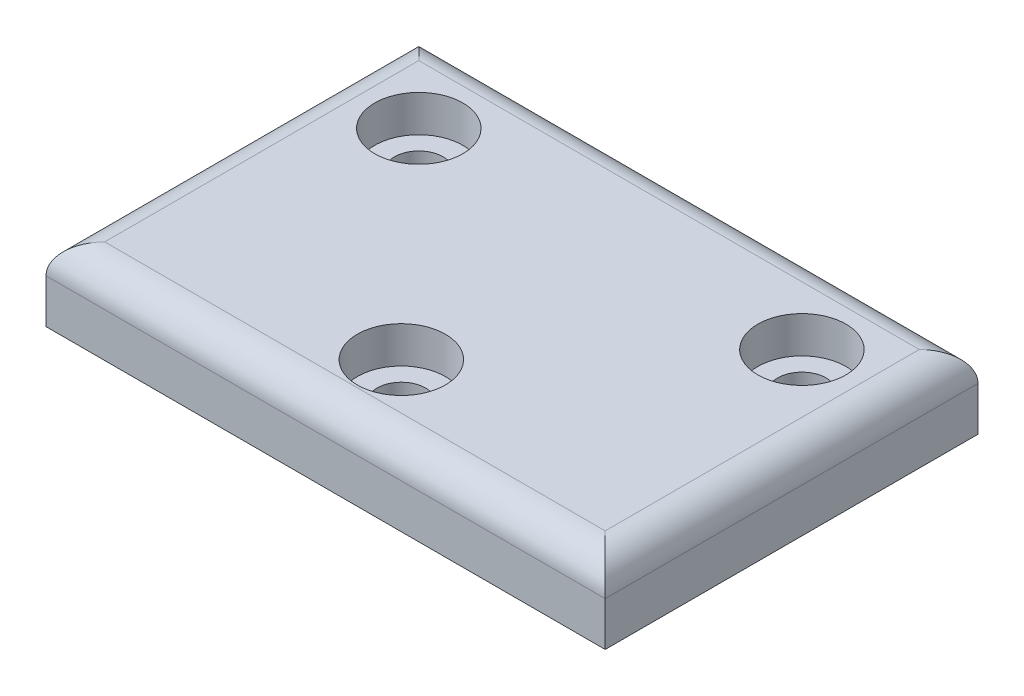
ISO-10303-21;
HEADER;
FILE_DESCRIPTION(('STEP AP214'),'2;1');
FILE_NAME('part.step','',(''),(''),'','','');
FILE_SCHEMA(('AUTOMOTIVE_DESIGN { 1 0 10303 214 1 1 1 1 }'));
ENDSEC;
DATA;
#1=APPLICATION_CONTEXT('core data for automotive mechanical design processes');
#2=APPLICATION_PROTOCOL_DEFINITION('international standard','automotive_design',2000,#1);
#3=PRODUCT_CONTEXT('',#1,'mechanical');
#4=PRODUCT('Part','Part','',(#3));
#5=PRODUCT_RELATED_PRODUCT_CATEGORY('part','',(#4));
#6=PRODUCT_DEFINITION_FORMATION('','',#4);
#7=PRODUCT_DEFINITION_CONTEXT('part definition',#1,'design');
#8=PRODUCT_DEFINITION('design','',#6,#7);
#9=PRODUCT_DEFINITION_SHAPE('','',#8);
#10=(LENGTH_UNIT() NAMED_UNIT(*) SI_UNIT(.MILLI.,.METRE.));
#11=(NAMED_UNIT(*) PLANE_ANGLE_UNIT() SI_UNIT($,.RADIAN.));
#12=(NAMED_UNIT(*) SI_UNIT($,.STERADIAN.) SOLID_ANGLE_UNIT());
#13=UNCERTAINTY_MEASURE_WITH_UNIT(LENGTH_MEASURE(1.E-05),#10,'distance_accuracy_value','');
#14=(GEOMETRIC_REPRESENTATION_CONTEXT(3) GLOBAL_UNCERTAINTY_ASSIGNED_CONTEXT((#13)) GLOBAL_UNIT_ASSIGNED_CONTEXT((#10,
#11,#12)) REPRESENTATION_CONTEXT('',''));
#15=CARTESIAN_POINT('',(0.,0.,0.));
#16=DIRECTION('',(0.,0.,1.));
#17=DIRECTION('',(1.,0.,0.));
#18=AXIS2_PLACEMENT_3D('',#15,#16,#17);
#19=CARTESIAN_POINT('',(19.05,5.,-5.16));
#20=DIRECTION('',(0.,-1.,0.));
#21=DIRECTION('',(0.,0.,-1.));
#22=AXIS2_PLACEMENT_3D('',#19,#20,#21);
#23=CYLINDRICAL_SURFACE('',#22,1.65);
#24=CARTESIAN_POINT('',(19.05,0.,-5.16));
#25=DIRECTION('',(0.,1.,0.));
#26=DIRECTION('',(0.,0.,1.));
#27=AXIS2_PLACEMENT_3D('',#24,#25,#26);
#28=CIRCLE('',#27,1.65);
#29=CARTESIAN_POINT('',(19.05,0.,-3.51));
#30=VERTEX_POINT('',#29);
#31=EDGE_CURVE('E121',#30,#30,#28,.T.);
#32=ORIENTED_EDGE('',*,*,#31,.F.);
#33=EDGE_LOOP('',(#32));
#34=FACE_BOUND('',#33,.T.);
#35=CARTESIAN_POINT('',(19.05,2.5,-5.16));
#36=DIRECTION('',(0.,1.,0.));
#37=DIRECTION('',(0.,0.,1.));
#38=AXIS2_PLACEMENT_3D('',#35,#36,#37);
#39=CIRCLE('',#38,1.65);
#40=CARTESIAN_POINT('',(19.05,2.5,-3.51));
#41=VERTEX_POINT('',#40);
#42=EDGE_CURVE('E147',#41,#41,#39,.T.);
#43=ORIENTED_EDGE('',*,*,#42,.T.);
#44=EDGE_LOOP('',(#43));
#45=FACE_BOUND('',#44,.T.);
#46=ADVANCED_FACE('F42',(#34,#45),#23,.F.);
#47=CARTESIAN_POINT('',(6.,5.,-19.4));
#48=DIRECTION('',(0.,-1.,0.));
#49=DIRECTION('',(0.,0.,-1.));
#50=AXIS2_PLACEMENT_3D('',#47,#48,#49);
#51=CYLINDRICAL_SURFACE('',#50,1.65);
#52=CARTESIAN_POINT('',(6.,0.,-19.4));
#53=DIRECTION('',(0.,1.,0.));
#54=DIRECTION('',(0.,0.,1.));
#55=AXIS2_PLACEMENT_3D('',#52,#53,#54);
#56=CIRCLE('',#55,1.65);
#57=CARTESIAN_POINT('',(6.,0.,-17.75));
#58=VERTEX_POINT('',#57);
#59=EDGE_CURVE('E124',#58,#58,#56,.T.);
#60=ORIENTED_EDGE('',*,*,#59,.F.);
#61=EDGE_LOOP('',(#60));
#62=FACE_BOUND('',#61,.T.);
#63=CARTESIAN_POINT('',(6.,2.5,-19.4));
#64=DIRECTION('',(0.,1.,0.));
#65=DIRECTION('',(0.,0.,1.));
#66=AXIS2_PLACEMENT_3D('',#63,#64,#65);
#67=CIRCLE('',#66,1.65);
#68=CARTESIAN_POINT('',(6.,2.5,-17.75));
#69=VERTEX_POINT('',#68);
#70=EDGE_CURVE('E144',#69,#69,#67,.T.);
#71=ORIENTED_EDGE('',*,*,#70,.T.);
#72=EDGE_LOOP('',(#71));
#73=FACE_BOUND('',#72,.T.);
#74=ADVANCED_FACE('F213',(#62,#73),#51,.F.);
#75=CARTESIAN_POINT('',(32.1,5.,-19.4));
#76=DIRECTION('',(0.,-1.,0.));
#77=DIRECTION('',(0.,0.,-1.));
#78=AXIS2_PLACEMENT_3D('',#75,#76,#77);
#79=CYLINDRICAL_SURFACE('',#78,1.65);
#80=CARTESIAN_POINT('',(32.1,0.,-19.4));
#81=DIRECTION('',(0.,1.,0.));
#82=DIRECTION('',(0.,0.,-1.));
#83=AXIS2_PLACEMENT_3D('',#80,#81,#82);
#84=CIRCLE('',#83,1.65);
#85=CARTESIAN_POINT('',(32.1,0.,-21.05));
#86=VERTEX_POINT('',#85);
#87=EDGE_CURVE('E152',#86,#86,#84,.T.);
#88=ORIENTED_EDGE('',*,*,#87,.F.);
#89=EDGE_LOOP('',(#88));
#90=FACE_BOUND('',#89,.T.);
#91=CARTESIAN_POINT('',(32.1,2.5,-19.4));
#92=DIRECTION('',(0.,1.,0.));
#93=DIRECTION('',(0.,0.,1.));
#94=AXIS2_PLACEMENT_3D('',#91,#92,#93);
#95=CIRCLE('',#94,1.65);
#96=CARTESIAN_POINT('',(32.1,2.5,-17.75));
#97=VERTEX_POINT('',#96);
#98=EDGE_CURVE('E143',#97,#97,#95,.T.);
#99=ORIENTED_EDGE('',*,*,#98,.T.);
#100=EDGE_LOOP('',(#99));
#101=FACE_BOUND('',#100,.T.);
#102=ADVANCED_FACE('F216',(#90,#101),#79,.F.);
#103=CARTESIAN_POINT('',(0.,5.,0.));
#104=DIRECTION('',(0.,1.,0.));
#105=DIRECTION('',(0.,0.,1.));
#106=AXIS2_PLACEMENT_3D('',#103,#104,#105);
#107=PLANE('',#106);
#108=DIRECTION('',(1.,0.,0.));
#109=VECTOR('',#108,1.);
#110=CARTESIAN_POINT('',(38.1,5.,-2.));
#111=LINE('',#110,#109);
#112=CARTESIAN_POINT('',(2.,5.,-2.));
#113=VERTEX_POINT('',#112);
#114=CARTESIAN_POINT('',(36.1,5.,-2.));
#115=VERTEX_POINT('',#114);
#116=EDGE_CURVE('E159',#113,#115,#111,.T.);
#117=ORIENTED_EDGE('',*,*,#116,.T.);
#118=DIRECTION('',(0.,0.,-1.));
#119=VECTOR('',#118,1.);
#120=CARTESIAN_POINT('',(36.1,5.,-25.4));
#121=LINE('',#120,#119);
#122=CARTESIAN_POINT('',(36.1,5.,-23.4));
#123=VERTEX_POINT('',#122);
#124=EDGE_CURVE('E162',#115,#123,#121,.T.);
#125=ORIENTED_EDGE('',*,*,#124,.T.);
#126=DIRECTION('',(-1.,0.,0.));
#127=VECTOR('',#126,1.);
#128=CARTESIAN_POINT('',(0.,5.,-23.4));
#129=LINE('',#128,#127);
#130=CARTESIAN_POINT('',(2.,5.,-23.4));
#131=VERTEX_POINT('',#130);
#132=EDGE_CURVE('E102',#123,#131,#129,.T.);
#133=ORIENTED_EDGE('',*,*,#132,.T.);
#134=DIRECTION('',(0.,0.,1.));
#135=VECTOR('',#134,1.);
#136=CARTESIAN_POINT('',(2.,5.,0.));
#137=LINE('',#136,#135);
#138=EDGE_CURVE('E160',#131,#113,#137,.T.);
#139=ORIENTED_EDGE('',*,*,#138,.T.);
#140=EDGE_LOOP('',(#117,#125,#133,#139));
#141=FACE_BOUND('',#140,.T.);
#142=CARTESIAN_POINT('',(6.,5.,-19.4));
#143=DIRECTION('',(0.,1.,0.));
#144=DIRECTION('',(0.,0.,1.));
#145=AXIS2_PLACEMENT_3D('',#142,#143,#144);
#146=CIRCLE('',#145,3.);
#147=CARTESIAN_POINT('',(6.,5.,-16.4));
#148=VERTEX_POINT('',#147);
#149=EDGE_CURVE('E226',#148,#148,#146,.T.);
#150=ORIENTED_EDGE('',*,*,#149,.F.);
#151=EDGE_LOOP('',(#150));
#152=FACE_BOUND('',#151,.T.);
#153=CARTESIAN_POINT('',(19.05,5.,-5.16));
#154=DIRECTION('',(0.,1.,0.));
#155=DIRECTION('',(0.,0.,1.));
#156=AXIS2_PLACEMENT_3D('',#153,#154,#155);
#157=CIRCLE('',#156,3.);
#158=CARTESIAN_POINT('',(19.05,5.,-2.16));
#159=VERTEX_POINT('',#158);
#160=EDGE_CURVE('E232',#159,#159,#157,.T.);
#161=ORIENTED_EDGE('',*,*,#160,.F.);
#162=EDGE_LOOP('',(#161));
#163=FACE_BOUND('',#162,.T.);
#164=CARTESIAN_POINT('',(32.1,5.,-19.4));
#165=DIRECTION('',(0.,1.,0.));
#166=DIRECTION('',(0.,0.,1.));
#167=AXIS2_PLACEMENT_3D('',#164,#165,#166);
#168=CIRCLE('',#167,3.);
#169=CARTESIAN_POINT('',(32.1,5.,-16.4));
#170=VERTEX_POINT('',#169);
#171=EDGE_CURVE('E191',#170,#170,#168,.T.);
#172=ORIENTED_EDGE('',*,*,#171,.F.);
#173=EDGE_LOOP('',(#172));
#174=FACE_BOUND('',#173,.T.);
#175=ADVANCED_FACE('F246',(#141,#152,#163,#174),#107,.T.);
#176=CARTESIAN_POINT('',(0.,0.,0.));
#177=DIRECTION('',(0.,1.,0.));
#178=DIRECTION('',(0.,0.,1.));
#179=AXIS2_PLACEMENT_3D('',#176,#177,#178);
#180=PLANE('',#179);
#181=DIRECTION('',(0.,0.,1.));
#182=VECTOR('',#181,1.);
#183=CARTESIAN_POINT('',(0.,0.,-25.4));
#184=LINE('',#183,#182);
#185=CARTESIAN_POINT('',(0.,0.,-25.4));
#186=VERTEX_POINT('',#185);
#187=CARTESIAN_POINT('',(0.,0.,0.));
#188=VERTEX_POINT('',#187);
#189=EDGE_CURVE('E115',#186,#188,#184,.T.);
#190=ORIENTED_EDGE('',*,*,#189,.F.);
#191=DIRECTION('',(-1.,0.,0.));
#192=VECTOR('',#191,1.);
#193=CARTESIAN_POINT('',(0.,0.,-25.4));
#194=LINE('',#193,#192);
#195=CARTESIAN_POINT('',(38.1,0.,-25.4));
#196=VERTEX_POINT('',#195);
#197=EDGE_CURVE('E131',#196,#186,#194,.T.);
#198=ORIENTED_EDGE('',*,*,#197,.F.);
#199=DIRECTION('',(0.,0.,-1.));
#200=VECTOR('',#199,1.);
#201=CARTESIAN_POINT('',(38.1,0.,-25.4));
#202=LINE('',#201,#200);
#203=CARTESIAN_POINT('',(38.1,0.,0.));
#204=VERTEX_POINT('',#203);
#205=EDGE_CURVE('E111',#204,#196,#202,.T.);
#206=ORIENTED_EDGE('',*,*,#205,.F.);
#207=DIRECTION('',(1.,0.,0.));
#208=VECTOR('',#207,1.);
#209=CARTESIAN_POINT('',(0.,0.,0.));
#210=LINE('',#209,#208);
#211=EDGE_CURVE('E99',#188,#204,#210,.T.);
#212=ORIENTED_EDGE('',*,*,#211,.F.);
#213=EDGE_LOOP('',(#190,#198,#206,#212));
#214=FACE_BOUND('',#213,.T.);
#215=ORIENTED_EDGE('',*,*,#31,.T.);
#216=EDGE_LOOP('',(#215));
#217=FACE_BOUND('',#216,.T.);
#218=ORIENTED_EDGE('',*,*,#59,.T.);
#219=EDGE_LOOP('',(#218));
#220=FACE_BOUND('',#219,.T.);
#221=ORIENTED_EDGE('',*,*,#87,.T.);
#222=EDGE_LOOP('',(#221));
#223=FACE_BOUND('',#222,.T.);
#224=ADVANCED_FACE('F108',(#214,#217,#220,#223),#180,.F.);
#225=CARTESIAN_POINT('',(0.,5.,-25.4));
#226=DIRECTION('',(1.,0.,0.));
#227=DIRECTION('',(0.,0.,-1.));
#228=AXIS2_PLACEMENT_3D('',#225,#226,#227);
#229=PLANE('',#228);
#230=DIRECTION('',(0.,-1.,0.));
#231=VECTOR('',#230,1.);
#232=CARTESIAN_POINT('',(0.,5.,0.));
#233=LINE('',#232,#231);
#234=CARTESIAN_POINT('',(0.,3.,0.));
#235=VERTEX_POINT('',#234);
#236=EDGE_CURVE('E100',#235,#188,#233,.T.);
#237=ORIENTED_EDGE('',*,*,#236,.F.);
#238=DIRECTION('',(0.,0.,1.));
#239=VECTOR('',#238,1.);
#240=CARTESIAN_POINT('',(0.,3.,-25.4));
#241=LINE('',#240,#239);
#242=CARTESIAN_POINT('',(0.,3.,-25.4));
#243=VERTEX_POINT('',#242);
#244=EDGE_CURVE('E53',#235,#243,#241,.F.);
#245=ORIENTED_EDGE('',*,*,#244,.T.);
#246=DIRECTION('',(0.,-1.,0.));
#247=VECTOR('',#246,1.);
#248=CARTESIAN_POINT('',(0.,5.,-25.4));
#249=LINE('',#248,#247);
#250=EDGE_CURVE('E117',#243,#186,#249,.T.);
#251=ORIENTED_EDGE('',*,*,#250,.T.);
#252=ORIENTED_EDGE('',*,*,#189,.T.);
#253=EDGE_LOOP('',(#237,#245,#251,#252));
#254=FACE_BOUND('',#253,.T.);
#255=ADVANCED_FACE('F119',(#254),#229,.F.);
#256=CARTESIAN_POINT('',(0.,5.,0.));
#257=DIRECTION('',(0.,0.,-1.));
#258=DIRECTION('',(-1.,0.,0.));
#259=AXIS2_PLACEMENT_3D('',#256,#257,#258);
#260=PLANE('',#259);
#261=DIRECTION('',(0.,-1.,0.));
#262=VECTOR('',#261,1.);
#263=CARTESIAN_POINT('',(38.1,5.,0.));
#264=LINE('',#263,#262);
#265=CARTESIAN_POINT('',(38.1,3.,0.));
#266=VERTEX_POINT('',#265);
#267=EDGE_CURVE('E104',#266,#204,#264,.T.);
#268=ORIENTED_EDGE('',*,*,#267,.F.);
#269=DIRECTION('',(1.,0.,0.));
#270=VECTOR('',#269,1.);
#271=CARTESIAN_POINT('',(0.,3.,0.));
#272=LINE('',#271,#270);
#273=EDGE_CURVE('E67',#266,#235,#272,.F.);
#274=ORIENTED_EDGE('',*,*,#273,.T.);
#275=ORIENTED_EDGE('',*,*,#236,.T.);
#276=ORIENTED_EDGE('',*,*,#211,.T.);
#277=EDGE_LOOP('',(#268,#274,#275,#276));
#278=FACE_BOUND('',#277,.T.);
#279=ADVANCED_FACE('F97',(#278),#260,.F.);
#280=CARTESIAN_POINT('',(38.1,5.,-25.4));
#281=DIRECTION('',(-1.,0.,0.));
#282=DIRECTION('',(0.,0.,1.));
#283=AXIS2_PLACEMENT_3D('',#280,#281,#282);
#284=PLANE('',#283);
#285=DIRECTION('',(0.,-1.,0.));
#286=VECTOR('',#285,1.);
#287=CARTESIAN_POINT('',(38.1,5.,-25.4));
#288=LINE('',#287,#286);
#289=CARTESIAN_POINT('',(38.1,3.,-25.4));
#290=VERTEX_POINT('',#289);
#291=EDGE_CURVE('E137',#290,#196,#288,.T.);
#292=ORIENTED_EDGE('',*,*,#291,.F.);
#293=DIRECTION('',(0.,0.,-1.));
#294=VECTOR('',#293,1.);
#295=CARTESIAN_POINT('',(38.1,3.,0.));
#296=LINE('',#295,#294);
#297=EDGE_CURVE('E170',#290,#266,#296,.F.);
#298=ORIENTED_EDGE('',*,*,#297,.T.);
#299=ORIENTED_EDGE('',*,*,#267,.T.);
#300=ORIENTED_EDGE('',*,*,#205,.T.);
#301=EDGE_LOOP('',(#292,#298,#299,#300));
#302=FACE_BOUND('',#301,.T.);
#303=ADVANCED_FACE('F269',(#302),#284,.F.);
#304=CARTESIAN_POINT('',(0.,5.,-25.4));
#305=DIRECTION('',(0.,0.,1.));
#306=DIRECTION('',(1.,0.,0.));
#307=AXIS2_PLACEMENT_3D('',#304,#305,#306);
#308=PLANE('',#307);
#309=ORIENTED_EDGE('',*,*,#250,.F.);
#310=DIRECTION('',(-1.,0.,0.));
#311=VECTOR('',#310,1.);
#312=CARTESIAN_POINT('',(38.1,3.,-25.4));
#313=LINE('',#312,#311);
#314=EDGE_CURVE('E11',#243,#290,#313,.F.);
#315=ORIENTED_EDGE('',*,*,#314,.T.);
#316=ORIENTED_EDGE('',*,*,#291,.T.);
#317=ORIENTED_EDGE('',*,*,#197,.T.);
#318=EDGE_LOOP('',(#309,#315,#316,#317));
#319=FACE_BOUND('',#318,.T.);
#320=ADVANCED_FACE('F257',(#319),#308,.F.);
#321=CARTESIAN_POINT('',(32.1,2.5,-19.4));
#322=DIRECTION('',(0.,1.,0.));
#323=DIRECTION('',(0.,0.,1.));
#324=AXIS2_PLACEMENT_3D('',#321,#322,#323);
#325=CYLINDRICAL_SURFACE('',#324,3.);
#326=CARTESIAN_POINT('',(32.1,2.5,-19.4));
#327=DIRECTION('',(0.,1.,0.));
#328=DIRECTION('',(0.,0.,1.));
#329=AXIS2_PLACEMENT_3D('',#326,#327,#328);
#330=CIRCLE('',#329,3.);
#331=CARTESIAN_POINT('',(32.1,2.5,-16.4));
#332=VERTEX_POINT('',#331);
#333=EDGE_CURVE('E188',#332,#332,#330,.T.);
#334=ORIENTED_EDGE('',*,*,#333,.F.);
#335=EDGE_LOOP('',(#334));
#336=FACE_BOUND('',#335,.T.);
#337=ORIENTED_EDGE('',*,*,#171,.T.);
#338=EDGE_LOOP('',(#337));
#339=FACE_BOUND('',#338,.T.);
#340=ADVANCED_FACE('F260',(#336,#339),#325,.F.);
#341=CARTESIAN_POINT('',(32.1,2.5,-19.4));
#342=DIRECTION('',(0.,1.,0.));
#343=DIRECTION('',(0.,0.,1.));
#344=AXIS2_PLACEMENT_3D('',#341,#342,#343);
#345=PLANE('',#344);
#346=ORIENTED_EDGE('',*,*,#98,.F.);
#347=EDGE_LOOP('',(#346));
#348=FACE_BOUND('',#347,.T.);
#349=ORIENTED_EDGE('',*,*,#333,.T.);
#350=EDGE_LOOP('',(#349));
#351=FACE_BOUND('',#350,.T.);
#352=ADVANCED_FACE('F259',(#348,#351),#345,.T.);
#353=CARTESIAN_POINT('',(6.,2.5,-19.4));
#354=DIRECTION('',(0.,1.,0.));
#355=DIRECTION('',(0.,0.,1.));
#356=AXIS2_PLACEMENT_3D('',#353,#354,#355);
#357=CYLINDRICAL_SURFACE('',#356,3.);
#358=CARTESIAN_POINT('',(6.,2.5,-19.4));
#359=DIRECTION('',(0.,1.,0.));
#360=DIRECTION('',(0.,0.,1.));
#361=AXIS2_PLACEMENT_3D('',#358,#359,#360);
#362=CIRCLE('',#361,3.);
#363=CARTESIAN_POINT('',(6.,2.5,-16.4));
#364=VERTEX_POINT('',#363);
#365=EDGE_CURVE('E148',#364,#364,#362,.T.);
#366=ORIENTED_EDGE('',*,*,#365,.F.);
#367=EDGE_LOOP('',(#366));
#368=FACE_BOUND('',#367,.T.);
#369=ORIENTED_EDGE('',*,*,#149,.T.);
#370=EDGE_LOOP('',(#369));
#371=FACE_BOUND('',#370,.T.);
#372=ADVANCED_FACE('F221',(#368,#371),#357,.F.);
#373=CARTESIAN_POINT('',(6.,2.5,-19.4));
#374=DIRECTION('',(0.,1.,0.));
#375=DIRECTION('',(0.,0.,1.));
#376=AXIS2_PLACEMENT_3D('',#373,#374,#375);
#377=PLANE('',#376);
#378=ORIENTED_EDGE('',*,*,#70,.F.);
#379=EDGE_LOOP('',(#378));
#380=FACE_BOUND('',#379,.T.);
#381=ORIENTED_EDGE('',*,*,#365,.T.);
#382=EDGE_LOOP('',(#381));
#383=FACE_BOUND('',#382,.T.);
#384=ADVANCED_FACE('F219',(#380,#383),#377,.T.);
#385=CARTESIAN_POINT('',(19.05,2.5,-5.16));
#386=DIRECTION('',(0.,1.,0.));
#387=DIRECTION('',(0.,0.,1.));
#388=AXIS2_PLACEMENT_3D('',#385,#386,#387);
#389=CYLINDRICAL_SURFACE('',#388,3.);
#390=CARTESIAN_POINT('',(19.05,2.5,-5.16));
#391=DIRECTION('',(0.,1.,0.));
#392=DIRECTION('',(0.,0.,1.));
#393=AXIS2_PLACEMENT_3D('',#390,#391,#392);
#394=CIRCLE('',#393,3.);
#395=CARTESIAN_POINT('',(19.05,2.5,-2.16));
#396=VERTEX_POINT('',#395);
#397=EDGE_CURVE('E203',#396,#396,#394,.T.);
#398=ORIENTED_EDGE('',*,*,#397,.F.);
#399=EDGE_LOOP('',(#398));
#400=FACE_BOUND('',#399,.T.);
#401=ORIENTED_EDGE('',*,*,#160,.T.);
#402=EDGE_LOOP('',(#401));
#403=FACE_BOUND('',#402,.T.);
#404=ADVANCED_FACE('F224',(#400,#403),#389,.F.);
#405=CARTESIAN_POINT('',(19.05,2.5,-5.16));
#406=DIRECTION('',(0.,1.,0.));
#407=DIRECTION('',(0.,0.,1.));
#408=AXIS2_PLACEMENT_3D('',#405,#406,#407);
#409=PLANE('',#408);
#410=ORIENTED_EDGE('',*,*,#42,.F.);
#411=EDGE_LOOP('',(#410));
#412=FACE_BOUND('',#411,.T.);
#413=ORIENTED_EDGE('',*,*,#397,.T.);
#414=EDGE_LOOP('',(#413));
#415=FACE_BOUND('',#414,.T.);
#416=ADVANCED_FACE('F242',(#412,#415),#409,.T.);
#417=CARTESIAN_POINT('',(2.,3.,0.));
#418=DIRECTION('',(0.,0.,-1.));
#419=DIRECTION('',(-1.,0.,0.));
#420=AXIS2_PLACEMENT_3D('',#417,#418,#419);
#421=CYLINDRICAL_SURFACE('',#420,2.);
#422=CARTESIAN_POINT('',(2.,3.,-23.4));
#423=DIRECTION('',(0.707106781186547,0.,-0.707106781186548));
#424=DIRECTION('',(0.707106781186548,0.,0.707106781186547));
#425=AXIS2_PLACEMENT_3D('',#422,#423,#424);
#426=ELLIPSE('',#425,2.82842712474619,2.);
#427=EDGE_CURVE('E179',#243,#131,#426,.T.);
#428=ORIENTED_EDGE('',*,*,#427,.F.);
#429=ORIENTED_EDGE('',*,*,#244,.F.);
#430=CARTESIAN_POINT('',(2.,3.,-2.));
#431=DIRECTION('',(-0.707106781186548,0.,-0.707106781186547));
#432=DIRECTION('',(0.707106781186547,0.,-0.707106781186548));
#433=AXIS2_PLACEMENT_3D('',#430,#431,#432);
#434=ELLIPSE('',#433,2.82842712474619,2.);
#435=EDGE_CURVE('E48',#113,#235,#434,.F.);
#436=ORIENTED_EDGE('',*,*,#435,.F.);
#437=ORIENTED_EDGE('',*,*,#138,.F.);
#438=EDGE_LOOP('',(#428,#429,#436,#437));
#439=FACE_BOUND('',#438,.T.);
#440=ADVANCED_FACE('F46',(#439),#421,.T.);
#441=CARTESIAN_POINT('',(0.,3.,-2.));
#442=DIRECTION('',(-1.,0.,0.));
#443=DIRECTION('',(0.,0.,1.));
#444=AXIS2_PLACEMENT_3D('',#441,#442,#443);
#445=CYLINDRICAL_SURFACE('',#444,2.);
#446=ORIENTED_EDGE('',*,*,#435,.T.);
#447=ORIENTED_EDGE('',*,*,#273,.F.);
#448=CARTESIAN_POINT('',(36.1,3.,-2.));
#449=DIRECTION('',(-0.707106781186547,0.,0.707106781186548));
#450=DIRECTION('',(-0.707106781186548,0.,-0.707106781186547));
#451=AXIS2_PLACEMENT_3D('',#448,#449,#450);
#452=ELLIPSE('',#451,2.82842712474619,2.);
#453=EDGE_CURVE('E178',#115,#266,#452,.F.);
#454=ORIENTED_EDGE('',*,*,#453,.F.);
#455=ORIENTED_EDGE('',*,*,#116,.F.);
#456=EDGE_LOOP('',(#446,#447,#454,#455));
#457=FACE_BOUND('',#456,.T.);
#458=ADVANCED_FACE('F297',(#457),#445,.T.);
#459=CARTESIAN_POINT('',(0.,3.,-23.4));
#460=DIRECTION('',(1.,0.,0.));
#461=DIRECTION('',(0.,0.,-1.));
#462=AXIS2_PLACEMENT_3D('',#459,#460,#461);
#463=CYLINDRICAL_SURFACE('',#462,2.);
#464=ORIENTED_EDGE('',*,*,#427,.T.);
#465=ORIENTED_EDGE('',*,*,#132,.F.);
#466=CARTESIAN_POINT('',(36.1,3.,-23.4));
#467=DIRECTION('',(0.707106781186548,0.,0.707106781186547));
#468=DIRECTION('',(0.707106781186547,0.,-0.707106781186548));
#469=AXIS2_PLACEMENT_3D('',#466,#467,#468);
#470=ELLIPSE('',#469,2.82842712474619,2.);
#471=EDGE_CURVE('E171',#290,#123,#470,.T.);
#472=ORIENTED_EDGE('',*,*,#471,.F.);
#473=ORIENTED_EDGE('',*,*,#314,.F.);
#474=EDGE_LOOP('',(#464,#465,#472,#473));
#475=FACE_BOUND('',#474,.T.);
#476=ADVANCED_FACE('F293',(#475),#463,.T.);
#477=CARTESIAN_POINT('',(36.1,3.,0.));
#478=DIRECTION('',(0.,0.,1.));
#479=DIRECTION('',(1.,0.,0.));
#480=AXIS2_PLACEMENT_3D('',#477,#478,#479);
#481=CYLINDRICAL_SURFACE('',#480,2.);
#482=ORIENTED_EDGE('',*,*,#453,.T.);
#483=ORIENTED_EDGE('',*,*,#297,.F.);
#484=ORIENTED_EDGE('',*,*,#471,.T.);
#485=ORIENTED_EDGE('',*,*,#124,.F.);
#486=EDGE_LOOP('',(#482,#483,#484,#485));
#487=FACE_BOUND('',#486,.T.);
#488=ADVANCED_FACE('F295',(#487),#481,.T.);
#489=CLOSED_SHELL('',(#46,#74,#102,#175,#224,#255,#279,#303,#320,#340,#352,#372,#384,#404,#416,
#440,#458,#476,#488));
#490=MANIFOLD_SOLID_BREP('B2',#489);
#491=ADVANCED_BREP_SHAPE_REPRESENTATION('',(#18,#490),#14);
#492=SHAPE_DEFINITION_REPRESENTATION(#9,#491);
ENDSEC;
END-ISO-10303-21;
